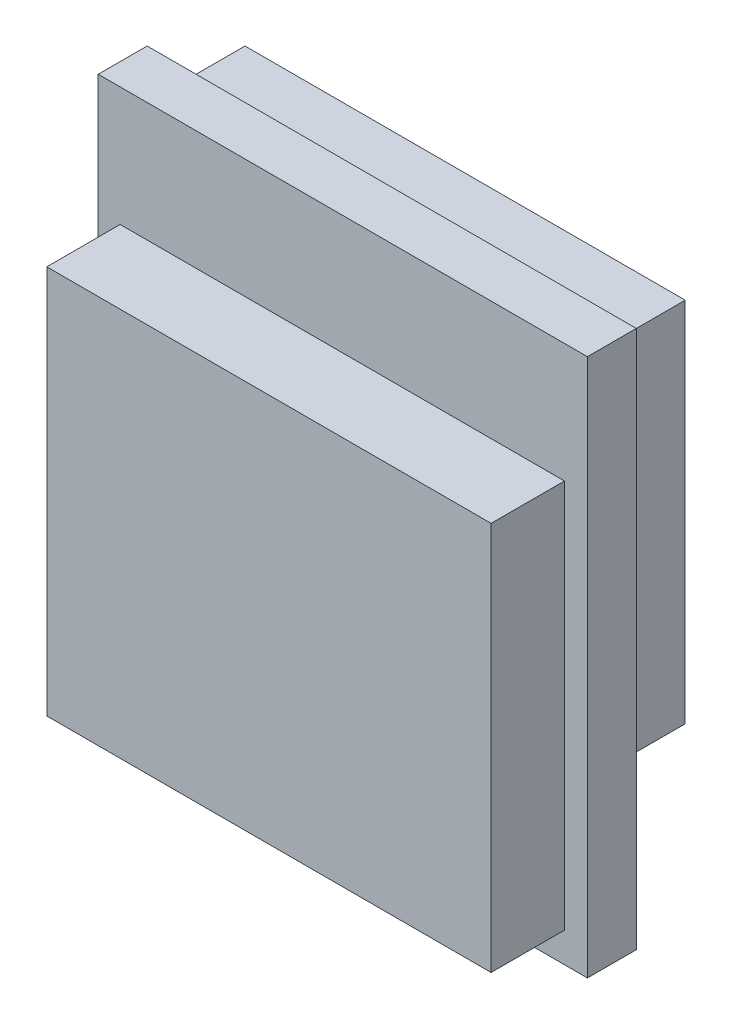
ISO-10303-21;
HEADER;
FILE_DESCRIPTION(('STEP AP214'),'2;1');
FILE_NAME('part.step','',(''),(''),'','','');
FILE_SCHEMA(('AUTOMOTIVE_DESIGN { 1 0 10303 214 1 1 1 1 }'));
ENDSEC;
DATA;
#1=APPLICATION_CONTEXT('core data for automotive mechanical design processes');
#2=APPLICATION_PROTOCOL_DEFINITION('international standard','automotive_design',2000,#1);
#3=PRODUCT_CONTEXT('',#1,'mechanical');
#4=PRODUCT('Part','Part','',(#3));
#5=PRODUCT_RELATED_PRODUCT_CATEGORY('part','',(#4));
#6=PRODUCT_DEFINITION_FORMATION('','',#4);
#7=PRODUCT_DEFINITION_CONTEXT('part definition',#1,'design');
#8=PRODUCT_DEFINITION('design','',#6,#7);
#9=PRODUCT_DEFINITION_SHAPE('','',#8);
#10=(LENGTH_UNIT() NAMED_UNIT(*) SI_UNIT(.MILLI.,.METRE.));
#11=(NAMED_UNIT(*) PLANE_ANGLE_UNIT() SI_UNIT($,.RADIAN.));
#12=(NAMED_UNIT(*) SI_UNIT($,.STERADIAN.) SOLID_ANGLE_UNIT());
#13=UNCERTAINTY_MEASURE_WITH_UNIT(LENGTH_MEASURE(1.E-05),#10,'distance_accuracy_value','');
#14=(GEOMETRIC_REPRESENTATION_CONTEXT(3) GLOBAL_UNCERTAINTY_ASSIGNED_CONTEXT((#13)) GLOBAL_UNIT_ASSIGNED_CONTEXT((#10,
#11,#12)) REPRESENTATION_CONTEXT('',''));
#15=CARTESIAN_POINT('',(0.,0.,0.));
#16=DIRECTION('',(0.,0.,1.));
#17=DIRECTION('',(1.,0.,0.));
#18=AXIS2_PLACEMENT_3D('',#15,#16,#17);
#19=CARTESIAN_POINT('',(-77.5858711935382,-132.478474405614,3.));
#20=DIRECTION('',(1.,0.,0.));
#21=DIRECTION('',(0.,0.,-1.));
#22=AXIS2_PLACEMENT_3D('',#19,#20,#21);
#23=PLANE('',#22);
#24=DIRECTION('',(0.,-1.,0.));
#25=VECTOR('',#24,1.);
#26=CARTESIAN_POINT('',(-77.5858711935382,-132.478474405614,0.));
#27=LINE('',#26,#25);
#28=CARTESIAN_POINT('',(-77.5858711935382,-132.478474405614,0.));
#29=VERTEX_POINT('',#28);
#30=CARTESIAN_POINT('',(-77.5858711935382,-147.478474405614,0.));
#31=VERTEX_POINT('',#30);
#32=EDGE_CURVE('E175',#29,#31,#27,.T.);
#33=ORIENTED_EDGE('',*,*,#32,.T.);
#34=DIRECTION('',(0.,0.,-1.));
#35=VECTOR('',#34,1.);
#36=CARTESIAN_POINT('',(-77.5858711935382,-147.478474405614,3.));
#37=LINE('',#36,#35);
#38=CARTESIAN_POINT('',(-77.5858711935382,-147.478474405614,3.));
#39=VERTEX_POINT('',#38);
#40=EDGE_CURVE('E11',#39,#31,#37,.T.);
#41=ORIENTED_EDGE('',*,*,#40,.F.);
#42=DIRECTION('',(0.,-1.,0.));
#43=VECTOR('',#42,1.);
#44=CARTESIAN_POINT('',(-77.5858711935382,-132.478474405614,3.));
#45=LINE('',#44,#43);
#46=CARTESIAN_POINT('',(-77.5858711935382,-132.478474405614,3.));
#47=VERTEX_POINT('',#46);
#48=EDGE_CURVE('E176',#47,#39,#45,.T.);
#49=ORIENTED_EDGE('',*,*,#48,.F.);
#50=DIRECTION('',(0.,0.,-1.));
#51=VECTOR('',#50,1.);
#52=CARTESIAN_POINT('',(-77.5858711935382,-132.478474405614,3.));
#53=LINE('',#52,#51);
#54=EDGE_CURVE('E187',#47,#29,#53,.T.);
#55=ORIENTED_EDGE('',*,*,#54,.T.);
#56=EDGE_LOOP('',(#33,#41,#49,#55));
#57=FACE_BOUND('',#56,.T.);
#58=ADVANCED_FACE('F32',(#57),#23,.F.);
#59=CARTESIAN_POINT('',(-77.5858711935382,-147.478474405614,3.));
#60=DIRECTION('',(0.,1.,0.));
#61=DIRECTION('',(0.,0.,1.));
#62=AXIS2_PLACEMENT_3D('',#59,#60,#61);
#63=PLANE('',#62);
#64=DIRECTION('',(1.,0.,0.));
#65=VECTOR('',#64,1.);
#66=CARTESIAN_POINT('',(-77.5858711935382,-147.478474405614,0.));
#67=LINE('',#66,#65);
#68=CARTESIAN_POINT('',(-59.5858711935382,-147.478474405614,0.));
#69=VERTEX_POINT('',#68);
#70=EDGE_CURVE('E190',#31,#69,#67,.T.);
#71=ORIENTED_EDGE('',*,*,#70,.T.);
#72=DIRECTION('',(0.,0.,-1.));
#73=VECTOR('',#72,1.);
#74=CARTESIAN_POINT('',(-59.5858711935382,-147.478474405614,3.));
#75=LINE('',#74,#73);
#76=CARTESIAN_POINT('',(-59.5858711935382,-147.478474405614,3.));
#77=VERTEX_POINT('',#76);
#78=EDGE_CURVE('E39',#77,#69,#75,.T.);
#79=ORIENTED_EDGE('',*,*,#78,.F.);
#80=DIRECTION('',(1.,0.,0.));
#81=VECTOR('',#80,1.);
#82=CARTESIAN_POINT('',(-77.5858711935382,-147.478474405614,3.));
#83=LINE('',#82,#81);
#84=EDGE_CURVE('E178',#39,#77,#83,.T.);
#85=ORIENTED_EDGE('',*,*,#84,.F.);
#86=ORIENTED_EDGE('',*,*,#40,.T.);
#87=EDGE_LOOP('',(#71,#79,#85,#86));
#88=FACE_BOUND('',#87,.T.);
#89=ADVANCED_FACE('F207',(#88),#63,.F.);
#90=CARTESIAN_POINT('',(-59.5858711935382,-132.478474405614,3.));
#91=DIRECTION('',(1.,0.,0.));
#92=DIRECTION('',(0.,1.,0.));
#93=AXIS2_PLACEMENT_3D('',#90,#91,#92);
#94=PLANE('',#93);
#95=DIRECTION('',(0.,-1.,0.));
#96=VECTOR('',#95,1.);
#97=CARTESIAN_POINT('',(-59.5858711935382,-132.478474405614,0.));
#98=LINE('',#97,#96);
#99=CARTESIAN_POINT('',(-59.5858711935382,-132.478474405614,0.));
#100=VERTEX_POINT('',#99);
#101=EDGE_CURVE('E193',#100,#69,#98,.T.);
#102=ORIENTED_EDGE('',*,*,#101,.F.);
#103=DIRECTION('',(0.,0.,-1.));
#104=VECTOR('',#103,1.);
#105=CARTESIAN_POINT('',(-59.5858711935382,-132.478474405614,3.));
#106=LINE('',#105,#104);
#107=CARTESIAN_POINT('',(-59.5858711935382,-132.478474405614,3.));
#108=VERTEX_POINT('',#107);
#109=EDGE_CURVE('E199',#108,#100,#106,.T.);
#110=ORIENTED_EDGE('',*,*,#109,.F.);
#111=DIRECTION('',(0.,-1.,0.));
#112=VECTOR('',#111,1.);
#113=CARTESIAN_POINT('',(-59.5858711935382,-132.478474405614,3.));
#114=LINE('',#113,#112);
#115=EDGE_CURVE('E181',#108,#77,#114,.T.);
#116=ORIENTED_EDGE('',*,*,#115,.T.);
#117=ORIENTED_EDGE('',*,*,#78,.T.);
#118=EDGE_LOOP('',(#102,#110,#116,#117));
#119=FACE_BOUND('',#118,.T.);
#120=ADVANCED_FACE('F203',(#119),#94,.T.);
#121=CARTESIAN_POINT('',(-77.5858711935382,-132.478474405614,3.));
#122=DIRECTION('',(0.,1.,0.));
#123=DIRECTION('',(0.,0.,1.));
#124=AXIS2_PLACEMENT_3D('',#121,#122,#123);
#125=PLANE('',#124);
#126=DIRECTION('',(1.,0.,0.));
#127=VECTOR('',#126,1.);
#128=CARTESIAN_POINT('',(-77.5858711935382,-132.478474405614,0.));
#129=LINE('',#128,#127);
#130=EDGE_CURVE('E179',#29,#100,#129,.T.);
#131=ORIENTED_EDGE('',*,*,#130,.F.);
#132=ORIENTED_EDGE('',*,*,#54,.F.);
#133=DIRECTION('',(1.,0.,0.));
#134=VECTOR('',#133,1.);
#135=CARTESIAN_POINT('',(-77.5858711935382,-132.478474405614,3.));
#136=LINE('',#135,#134);
#137=EDGE_CURVE('E184',#47,#108,#136,.T.);
#138=ORIENTED_EDGE('',*,*,#137,.T.);
#139=ORIENTED_EDGE('',*,*,#109,.T.);
#140=EDGE_LOOP('',(#131,#132,#138,#139));
#141=FACE_BOUND('',#140,.T.);
#142=ADVANCED_FACE('F215',(#141),#125,.T.);
#143=CARTESIAN_POINT('',(0.,0.,0.));
#144=DIRECTION('',(0.,0.,1.));
#145=DIRECTION('',(1.,0.,0.));
#146=AXIS2_PLACEMENT_3D('',#143,#144,#145);
#147=PLANE('',#146);
#148=ORIENTED_EDGE('',*,*,#32,.F.);
#149=ORIENTED_EDGE('',*,*,#130,.T.);
#150=ORIENTED_EDGE('',*,*,#101,.T.);
#151=ORIENTED_EDGE('',*,*,#70,.F.);
#152=EDGE_LOOP('',(#148,#149,#150,#151));
#153=FACE_BOUND('',#152,.T.);
#154=ADVANCED_FACE('F211',(#153),#147,.F.);
#155=CARTESIAN_POINT('',(0.,0.,3.));
#156=DIRECTION('',(0.,0.,1.));
#157=DIRECTION('',(1.,0.,0.));
#158=AXIS2_PLACEMENT_3D('',#155,#156,#157);
#159=PLANE('',#158);
#160=DIRECTION('',(0.,-1.,0.));
#161=VECTOR('',#160,1.);
#162=CARTESIAN_POINT('',(-78.5858711935382,-131.478474405614,3.));
#163=LINE('',#162,#161);
#164=CARTESIAN_POINT('',(-78.5858711935382,-131.478474405614,3.));
#165=VERTEX_POINT('',#164);
#166=CARTESIAN_POINT('',(-78.5858711935382,-153.478474405614,3.));
#167=VERTEX_POINT('',#166);
#168=EDGE_CURVE('E140',#165,#167,#163,.T.);
#169=ORIENTED_EDGE('',*,*,#168,.F.);
#170=DIRECTION('',(-1.,0.,0.));
#171=VECTOR('',#170,1.);
#172=CARTESIAN_POINT('',(-78.5858711935382,-131.478474405614,3.));
#173=LINE('',#172,#171);
#174=CARTESIAN_POINT('',(-58.5858711935382,-131.478474405614,3.));
#175=VERTEX_POINT('',#174);
#176=EDGE_CURVE('E153',#175,#165,#173,.T.);
#177=ORIENTED_EDGE('',*,*,#176,.F.);
#178=DIRECTION('',(0.,1.,0.));
#179=VECTOR('',#178,1.);
#180=CARTESIAN_POINT('',(-58.5858711935382,-131.478474405614,3.));
#181=LINE('',#180,#179);
#182=CARTESIAN_POINT('',(-58.5858711935382,-153.478474405614,3.));
#183=VERTEX_POINT('',#182);
#184=EDGE_CURVE('E161',#183,#175,#181,.T.);
#185=ORIENTED_EDGE('',*,*,#184,.F.);
#186=DIRECTION('',(1.,0.,0.));
#187=VECTOR('',#186,1.);
#188=CARTESIAN_POINT('',(-78.5858711935382,-153.478474405614,3.));
#189=LINE('',#188,#187);
#190=EDGE_CURVE('E143',#167,#183,#189,.T.);
#191=ORIENTED_EDGE('',*,*,#190,.F.);
#192=EDGE_LOOP('',(#169,#177,#185,#191));
#193=FACE_BOUND('',#192,.T.);
#194=ORIENTED_EDGE('',*,*,#137,.F.);
#195=ORIENTED_EDGE('',*,*,#48,.T.);
#196=ORIENTED_EDGE('',*,*,#84,.T.);
#197=ORIENTED_EDGE('',*,*,#115,.F.);
#198=EDGE_LOOP('',(#194,#195,#196,#197));
#199=FACE_BOUND('',#198,.T.);
#200=ADVANCED_FACE('F218',(#193,#199),#159,.F.);
#201=CARTESIAN_POINT('',(-78.5858711935382,-131.478474405614,5.));
#202=DIRECTION('',(1.,0.,0.));
#203=DIRECTION('',(0.,0.,-1.));
#204=AXIS2_PLACEMENT_3D('',#201,#202,#203);
#205=PLANE('',#204);
#206=ORIENTED_EDGE('',*,*,#168,.T.);
#207=DIRECTION('',(0.,0.,-1.));
#208=VECTOR('',#207,1.);
#209=CARTESIAN_POINT('',(-78.5858711935382,-153.478474405614,5.));
#210=LINE('',#209,#208);
#211=CARTESIAN_POINT('',(-78.5858711935382,-153.478474405614,5.));
#212=VERTEX_POINT('',#211);
#213=EDGE_CURVE('E172',#212,#167,#210,.T.);
#214=ORIENTED_EDGE('',*,*,#213,.F.);
#215=DIRECTION('',(0.,-1.,0.));
#216=VECTOR('',#215,1.);
#217=CARTESIAN_POINT('',(-78.5858711935382,-131.478474405614,5.));
#218=LINE('',#217,#216);
#219=CARTESIAN_POINT('',(-78.5858711935382,-131.478474405614,5.));
#220=VERTEX_POINT('',#219);
#221=EDGE_CURVE('E149',#220,#212,#218,.T.);
#222=ORIENTED_EDGE('',*,*,#221,.F.);
#223=DIRECTION('',(0.,0.,-1.));
#224=VECTOR('',#223,1.);
#225=CARTESIAN_POINT('',(-78.5858711935382,-131.478474405614,5.));
#226=LINE('',#225,#224);
#227=EDGE_CURVE('E158',#220,#165,#226,.T.);
#228=ORIENTED_EDGE('',*,*,#227,.T.);
#229=EDGE_LOOP('',(#206,#214,#222,#228));
#230=FACE_BOUND('',#229,.T.);
#231=ADVANCED_FACE('F233',(#230),#205,.F.);
#232=CARTESIAN_POINT('',(-78.5858711935382,-153.478474405614,5.));
#233=DIRECTION('',(0.,1.,0.));
#234=DIRECTION('',(0.,0.,1.));
#235=AXIS2_PLACEMENT_3D('',#232,#233,#234);
#236=PLANE('',#235);
#237=ORIENTED_EDGE('',*,*,#190,.T.);
#238=DIRECTION('',(0.,0.,-1.));
#239=VECTOR('',#238,1.);
#240=CARTESIAN_POINT('',(-58.5858711935382,-153.478474405614,5.));
#241=LINE('',#240,#239);
#242=CARTESIAN_POINT('',(-58.5858711935382,-153.478474405614,5.));
#243=VERTEX_POINT('',#242);
#244=EDGE_CURVE('E169',#243,#183,#241,.T.);
#245=ORIENTED_EDGE('',*,*,#244,.F.);
#246=DIRECTION('',(1.,0.,0.));
#247=VECTOR('',#246,1.);
#248=CARTESIAN_POINT('',(-78.5858711935382,-153.478474405614,5.));
#249=LINE('',#248,#247);
#250=EDGE_CURVE('E152',#212,#243,#249,.T.);
#251=ORIENTED_EDGE('',*,*,#250,.F.);
#252=ORIENTED_EDGE('',*,*,#213,.T.);
#253=EDGE_LOOP('',(#237,#245,#251,#252));
#254=FACE_BOUND('',#253,.T.);
#255=ADVANCED_FACE('F236',(#254),#236,.F.);
#256=CARTESIAN_POINT('',(-58.5858711935382,-131.478474405614,5.));
#257=DIRECTION('',(-1.,0.,0.));
#258=DIRECTION('',(0.,-1.,0.));
#259=AXIS2_PLACEMENT_3D('',#256,#257,#258);
#260=PLANE('',#259);
#261=ORIENTED_EDGE('',*,*,#184,.T.);
#262=DIRECTION('',(0.,0.,-1.));
#263=VECTOR('',#262,1.);
#264=CARTESIAN_POINT('',(-58.5858711935382,-131.478474405614,5.));
#265=LINE('',#264,#263);
#266=CARTESIAN_POINT('',(-58.5858711935382,-131.478474405614,5.));
#267=VERTEX_POINT('',#266);
#268=EDGE_CURVE('E166',#267,#175,#265,.T.);
#269=ORIENTED_EDGE('',*,*,#268,.F.);
#270=DIRECTION('',(0.,1.,0.));
#271=VECTOR('',#270,1.);
#272=CARTESIAN_POINT('',(-58.5858711935382,-131.478474405614,5.));
#273=LINE('',#272,#271);
#274=EDGE_CURVE('E155',#243,#267,#273,.T.);
#275=ORIENTED_EDGE('',*,*,#274,.F.);
#276=ORIENTED_EDGE('',*,*,#244,.T.);
#277=EDGE_LOOP('',(#261,#269,#275,#276));
#278=FACE_BOUND('',#277,.T.);
#279=ADVANCED_FACE('F240',(#278),#260,.F.);
#280=CARTESIAN_POINT('',(-78.5858711935382,-131.478474405614,5.));
#281=DIRECTION('',(0.,-1.,0.));
#282=DIRECTION('',(0.,0.,-1.));
#283=AXIS2_PLACEMENT_3D('',#280,#281,#282);
#284=PLANE('',#283);
#285=ORIENTED_EDGE('',*,*,#176,.T.);
#286=ORIENTED_EDGE('',*,*,#227,.F.);
#287=DIRECTION('',(-1.,0.,0.));
#288=VECTOR('',#287,1.);
#289=CARTESIAN_POINT('',(-78.5858711935382,-131.478474405614,5.));
#290=LINE('',#289,#288);
#291=EDGE_CURVE('E157',#267,#220,#290,.T.);
#292=ORIENTED_EDGE('',*,*,#291,.F.);
#293=ORIENTED_EDGE('',*,*,#268,.T.);
#294=EDGE_LOOP('',(#285,#286,#292,#293));
#295=FACE_BOUND('',#294,.T.);
#296=ADVANCED_FACE('F244',(#295),#284,.F.);
#297=CARTESIAN_POINT('',(0.,0.,5.));
#298=DIRECTION('',(0.,0.,1.));
#299=DIRECTION('',(1.,0.,0.));
#300=AXIS2_PLACEMENT_3D('',#297,#298,#299);
#301=PLANE('',#300);
#302=DIRECTION('',(0.,-1.,0.));
#303=VECTOR('',#302,1.);
#304=CARTESIAN_POINT('',(-77.6905153995529,-152.253013765358,5.));
#305=LINE('',#304,#303);
#306=CARTESIAN_POINT('',(-77.6905153995529,-136.349507003092,5.));
#307=VERTEX_POINT('',#306);
#308=CARTESIAN_POINT('',(-77.6905153995529,-152.253013765358,5.));
#309=VERTEX_POINT('',#308);
#310=EDGE_CURVE('E46',#307,#309,#305,.T.);
#311=ORIENTED_EDGE('',*,*,#310,.F.);
#312=DIRECTION('',(-1.,0.,0.));
#313=VECTOR('',#312,1.);
#314=CARTESIAN_POINT('',(-77.6905153995529,-136.349507003092,5.));
#315=LINE('',#314,#313);
#316=CARTESIAN_POINT('',(-59.5235881992122,-136.349507003092,5.));
#317=VERTEX_POINT('',#316);
#318=EDGE_CURVE('E50',#317,#307,#315,.T.);
#319=ORIENTED_EDGE('',*,*,#318,.F.);
#320=DIRECTION('',(0.,1.,0.));
#321=VECTOR('',#320,1.);
#322=CARTESIAN_POINT('',(-59.5235881992122,-152.253013765358,5.));
#323=LINE('',#322,#321);
#324=CARTESIAN_POINT('',(-59.5235881992122,-152.253013765358,5.));
#325=VERTEX_POINT('',#324);
#326=EDGE_CURVE('E363',#325,#317,#323,.T.);
#327=ORIENTED_EDGE('',*,*,#326,.F.);
#328=DIRECTION('',(1.,0.,0.));
#329=VECTOR('',#328,1.);
#330=CARTESIAN_POINT('',(-77.6905153995529,-152.253013765358,5.));
#331=LINE('',#330,#329);
#332=EDGE_CURVE('E369',#309,#325,#331,.T.);
#333=ORIENTED_EDGE('',*,*,#332,.F.);
#334=EDGE_LOOP('',(#311,#319,#327,#333));
#335=FACE_BOUND('',#334,.T.);
#336=ORIENTED_EDGE('',*,*,#221,.T.);
#337=ORIENTED_EDGE('',*,*,#250,.T.);
#338=ORIENTED_EDGE('',*,*,#274,.T.);
#339=ORIENTED_EDGE('',*,*,#291,.T.);
#340=EDGE_LOOP('',(#336,#337,#338,#339));
#341=FACE_BOUND('',#340,.T.);
#342=ADVANCED_FACE('F248',(#335,#341),#301,.T.);
#343=CARTESIAN_POINT('',(-77.6905153995529,-152.253013765358,8.));
#344=DIRECTION('',(1.,0.,0.));
#345=DIRECTION('',(0.,0.,-1.));
#346=AXIS2_PLACEMENT_3D('',#343,#344,#345);
#347=PLANE('',#346);
#348=ORIENTED_EDGE('',*,*,#310,.T.);
#349=DIRECTION('',(0.,0.,-1.));
#350=VECTOR('',#349,1.);
#351=CARTESIAN_POINT('',(-77.6905153995529,-152.253013765358,8.));
#352=LINE('',#351,#350);
#353=CARTESIAN_POINT('',(-77.6905153995529,-152.253013765358,8.));
#354=VERTEX_POINT('',#353);
#355=EDGE_CURVE('E123',#354,#309,#352,.T.);
#356=ORIENTED_EDGE('',*,*,#355,.F.);
#357=DIRECTION('',(0.,-1.,0.));
#358=VECTOR('',#357,1.);
#359=CARTESIAN_POINT('',(-77.6905153995529,-152.253013765358,8.));
#360=LINE('',#359,#358);
#361=CARTESIAN_POINT('',(-77.6905153995529,-136.349507003092,8.));
#362=VERTEX_POINT('',#361);
#363=EDGE_CURVE('E129',#362,#354,#360,.T.);
#364=ORIENTED_EDGE('',*,*,#363,.F.);
#365=DIRECTION('',(0.,0.,-1.));
#366=VECTOR('',#365,1.);
#367=CARTESIAN_POINT('',(-77.6905153995529,-136.349507003092,8.));
#368=LINE('',#367,#366);
#369=EDGE_CURVE('E361',#362,#307,#368,.T.);
#370=ORIENTED_EDGE('',*,*,#369,.T.);
#371=EDGE_LOOP('',(#348,#356,#364,#370));
#372=FACE_BOUND('',#371,.T.);
#373=ADVANCED_FACE('F139',(#372),#347,.F.);
#374=CARTESIAN_POINT('',(-77.6905153995529,-152.253013765358,8.));
#375=DIRECTION('',(0.,1.,0.));
#376=DIRECTION('',(0.,0.,1.));
#377=AXIS2_PLACEMENT_3D('',#374,#375,#376);
#378=PLANE('',#377);
#379=ORIENTED_EDGE('',*,*,#332,.T.);
#380=DIRECTION('',(0.,0.,-1.));
#381=VECTOR('',#380,1.);
#382=CARTESIAN_POINT('',(-59.5235881992122,-152.253013765358,8.));
#383=LINE('',#382,#381);
#384=CARTESIAN_POINT('',(-59.5235881992122,-152.253013765358,8.));
#385=VERTEX_POINT('',#384);
#386=EDGE_CURVE('E125',#385,#325,#383,.T.);
#387=ORIENTED_EDGE('',*,*,#386,.F.);
#388=DIRECTION('',(1.,0.,0.));
#389=VECTOR('',#388,1.);
#390=CARTESIAN_POINT('',(-77.6905153995529,-152.253013765358,8.));
#391=LINE('',#390,#389);
#392=EDGE_CURVE('E118',#354,#385,#391,.T.);
#393=ORIENTED_EDGE('',*,*,#392,.F.);
#394=ORIENTED_EDGE('',*,*,#355,.T.);
#395=EDGE_LOOP('',(#379,#387,#393,#394));
#396=FACE_BOUND('',#395,.T.);
#397=ADVANCED_FACE('F121',(#396),#378,.F.);
#398=CARTESIAN_POINT('',(-59.5235881992122,-152.253013765358,8.));
#399=DIRECTION('',(-1.,0.,0.));
#400=DIRECTION('',(0.,0.,1.));
#401=AXIS2_PLACEMENT_3D('',#398,#399,#400);
#402=PLANE('',#401);
#403=ORIENTED_EDGE('',*,*,#326,.T.);
#404=DIRECTION('',(0.,0.,-1.));
#405=VECTOR('',#404,1.);
#406=CARTESIAN_POINT('',(-59.5235881992122,-136.349507003092,8.));
#407=LINE('',#406,#405);
#408=CARTESIAN_POINT('',(-59.5235881992122,-136.349507003092,8.));
#409=VERTEX_POINT('',#408);
#410=EDGE_CURVE('E145',#409,#317,#407,.T.);
#411=ORIENTED_EDGE('',*,*,#410,.F.);
#412=DIRECTION('',(0.,1.,0.));
#413=VECTOR('',#412,1.);
#414=CARTESIAN_POINT('',(-59.5235881992122,-152.253013765358,8.));
#415=LINE('',#414,#413);
#416=EDGE_CURVE('E128',#385,#409,#415,.T.);
#417=ORIENTED_EDGE('',*,*,#416,.F.);
#418=ORIENTED_EDGE('',*,*,#386,.T.);
#419=EDGE_LOOP('',(#403,#411,#417,#418));
#420=FACE_BOUND('',#419,.T.);
#421=ADVANCED_FACE('F259',(#420),#402,.F.);
#422=CARTESIAN_POINT('',(-77.6905153995529,-136.349507003092,8.));
#423=DIRECTION('',(0.,-1.,0.));
#424=DIRECTION('',(0.,0.,-1.));
#425=AXIS2_PLACEMENT_3D('',#422,#423,#424);
#426=PLANE('',#425);
#427=ORIENTED_EDGE('',*,*,#318,.T.);
#428=ORIENTED_EDGE('',*,*,#369,.F.);
#429=DIRECTION('',(-1.,0.,0.));
#430=VECTOR('',#429,1.);
#431=CARTESIAN_POINT('',(-77.6905153995529,-136.349507003092,8.));
#432=LINE('',#431,#430);
#433=EDGE_CURVE('E134',#409,#362,#432,.T.);
#434=ORIENTED_EDGE('',*,*,#433,.F.);
#435=ORIENTED_EDGE('',*,*,#410,.T.);
#436=EDGE_LOOP('',(#427,#428,#434,#435));
#437=FACE_BOUND('',#436,.T.);
#438=ADVANCED_FACE('F262',(#437),#426,.F.);
#439=CARTESIAN_POINT('',(0.,0.,8.));
#440=DIRECTION('',(0.,0.,-1.));
#441=DIRECTION('',(-1.,0.,0.));
#442=AXIS2_PLACEMENT_3D('',#439,#440,#441);
#443=PLANE('',#442);
#444=ORIENTED_EDGE('',*,*,#363,.T.);
#445=ORIENTED_EDGE('',*,*,#392,.T.);
#446=ORIENTED_EDGE('',*,*,#416,.T.);
#447=ORIENTED_EDGE('',*,*,#433,.T.);
#448=EDGE_LOOP('',(#444,#445,#446,#447));
#449=FACE_BOUND('',#448,.T.);
#450=ADVANCED_FACE('F132',(#449),#443,.F.);
#451=CLOSED_SHELL('',(#58,#89,#120,#142,#154,#200,#231,#255,#279,#296,#342,#373,#397,#421,#438,#450));
#452=MANIFOLD_SOLID_BREP('B2',#451);
#453=ADVANCED_BREP_SHAPE_REPRESENTATION('',(#18,#452),#14);
#454=SHAPE_DEFINITION_REPRESENTATION(#9,#453);
ENDSEC;
END-ISO-10303-21;
